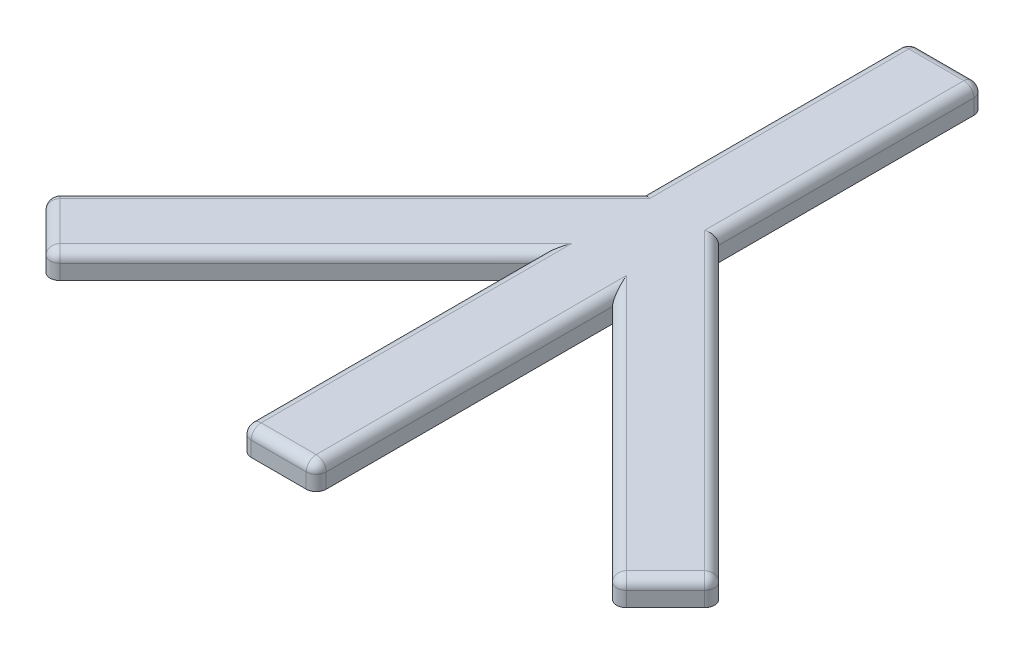
ISO-10303-21;
HEADER;
FILE_DESCRIPTION(('STEP AP214'),'2;1');
FILE_NAME('part.step','',(''),(''),'','','');
FILE_SCHEMA(('AUTOMOTIVE_DESIGN { 1 0 10303 214 1 1 1 1 }'));
ENDSEC;
DATA;
#1=APPLICATION_CONTEXT('core data for automotive mechanical design processes');
#2=APPLICATION_PROTOCOL_DEFINITION('international standard','automotive_design',2000,#1);
#3=PRODUCT_CONTEXT('',#1,'mechanical');
#4=PRODUCT('Part','Part','',(#3));
#5=PRODUCT_RELATED_PRODUCT_CATEGORY('part','',(#4));
#6=PRODUCT_DEFINITION_FORMATION('','',#4);
#7=PRODUCT_DEFINITION_CONTEXT('part definition',#1,'design');
#8=PRODUCT_DEFINITION('design','',#6,#7);
#9=PRODUCT_DEFINITION_SHAPE('','',#8);
#10=(LENGTH_UNIT() NAMED_UNIT(*) SI_UNIT(.MILLI.,.METRE.));
#11=(NAMED_UNIT(*) PLANE_ANGLE_UNIT() SI_UNIT($,.RADIAN.));
#12=(NAMED_UNIT(*) SI_UNIT($,.STERADIAN.) SOLID_ANGLE_UNIT());
#13=UNCERTAINTY_MEASURE_WITH_UNIT(LENGTH_MEASURE(1.E-05),#10,'distance_accuracy_value','');
#14=(GEOMETRIC_REPRESENTATION_CONTEXT(3) GLOBAL_UNCERTAINTY_ASSIGNED_CONTEXT((#13)) GLOBAL_UNIT_ASSIGNED_CONTEXT((#10,
#11,#12)) REPRESENTATION_CONTEXT('',''));
#15=CARTESIAN_POINT('',(0.,0.,0.));
#16=DIRECTION('',(0.,0.,1.));
#17=DIRECTION('',(1.,0.,0.));
#18=AXIS2_PLACEMENT_3D('',#15,#16,#17);
#19=CARTESIAN_POINT('',(56.5917249340142,5.,56.5917249340142));
#20=DIRECTION('',(-0.707106781186548,0.,-0.707106781186548));
#21=DIRECTION('',(-0.707106781186548,0.,0.707106781186548));
#22=AXIS2_PLACEMENT_3D('',#19,#20,#21);
#23=PLANE('',#22);
#24=DIRECTION('',(0.707106781186548,0.,-0.707106781186548));
#25=VECTOR('',#24,1.);
#26=CARTESIAN_POINT('',(56.5917249340142,0.,56.5917249340142));
#27=LINE('',#26,#25);
#28=CARTESIAN_POINT('',(58.0059384963873,0.,55.1775113716411));
#29=VERTEX_POINT('',#28);
#30=CARTESIAN_POINT('',(65.7841130894393,0.,47.3993367785891));
#31=VERTEX_POINT('',#30);
#32=EDGE_CURVE('E217',#29,#31,#27,.T.);
#33=ORIENTED_EDGE('',*,*,#32,.T.);
#34=DIRECTION('',(0.,-1.,0.));
#35=VECTOR('',#34,1.);
#36=CARTESIAN_POINT('',(65.7841130894393,5.,47.3993367785891));
#37=LINE('',#36,#35);
#38=CARTESIAN_POINT('',(65.7841130894393,3.,47.3993367785891));
#39=VERTEX_POINT('',#38);
#40=EDGE_CURVE('E391',#31,#39,#37,.F.);
#41=ORIENTED_EDGE('',*,*,#40,.T.);
#42=DIRECTION('',(0.707106781186548,0.,-0.707106781186548));
#43=VECTOR('',#42,1.);
#44=CARTESIAN_POINT('',(56.5917249340142,3.,56.5917249340142));
#45=LINE('',#44,#43);
#46=CARTESIAN_POINT('',(58.0059384963873,3.,55.1775113716411));
#47=VERTEX_POINT('',#46);
#48=EDGE_CURVE('E278',#39,#47,#45,.F.);
#49=ORIENTED_EDGE('',*,*,#48,.T.);
#50=DIRECTION('',(0.,-1.,0.));
#51=VECTOR('',#50,1.);
#52=CARTESIAN_POINT('',(58.0059384963873,0.,55.1775113716411));
#53=LINE('',#52,#51);
#54=EDGE_CURVE('E389',#47,#29,#53,.T.);
#55=ORIENTED_EDGE('',*,*,#54,.T.);
#56=EDGE_LOOP('',(#33,#41,#49,#55));
#57=FACE_BOUND('',#56,.T.);
#58=ADVANCED_FACE('F35',(#57),#23,.F.);
#59=CARTESIAN_POINT('',(10.6066017177982,5.,-10.6066017177982));
#60=DIRECTION('',(-0.707106781186547,0.,0.707106781186548));
#61=DIRECTION('',(0.707106781186548,0.,0.707106781186547));
#62=AXIS2_PLACEMENT_3D('',#59,#60,#61);
#63=PLANE('',#62);
#64=DIRECTION('',(-0.707106781186548,0.,-0.707106781186547));
#65=VECTOR('',#64,1.);
#66=CARTESIAN_POINT('',(67.1983266518124,3.,45.985123216216));
#67=LINE('',#66,#65);
#68=CARTESIAN_POINT('',(7.49999999999999,3.,-13.7132034355964));
#69=VERTEX_POINT('',#68);
#70=CARTESIAN_POINT('',(65.7841130894393,3.,44.5709096538429));
#71=VERTEX_POINT('',#70);
#72=EDGE_CURVE('E292',#69,#71,#67,.F.);
#73=ORIENTED_EDGE('',*,*,#72,.T.);
#74=DIRECTION('',(0.,-1.,0.));
#75=VECTOR('',#74,1.);
#76=CARTESIAN_POINT('',(65.7841130894393,5.,44.5709096538429));
#77=LINE('',#76,#75);
#78=CARTESIAN_POINT('',(65.7841130894393,0.,44.5709096538429));
#79=VERTEX_POINT('',#78);
#80=EDGE_CURVE('E52',#71,#79,#77,.T.);
#81=ORIENTED_EDGE('',*,*,#80,.T.);
#82=DIRECTION('',(-0.707106781186548,0.,-0.707106781186547));
#83=VECTOR('',#82,1.);
#84=CARTESIAN_POINT('',(10.6066017177982,0.,-10.6066017177982));
#85=LINE('',#84,#83);
#86=CARTESIAN_POINT('',(7.49999999999999,0.,-13.7132034355964));
#87=VERTEX_POINT('',#86);
#88=EDGE_CURVE('E210',#79,#87,#85,.T.);
#89=ORIENTED_EDGE('',*,*,#88,.T.);
#90=DIRECTION('',(0.,-1.,0.));
#91=VECTOR('',#90,1.);
#92=CARTESIAN_POINT('',(7.49999999999999,5.,-13.7132034355964));
#93=LINE('',#92,#91);
#94=EDGE_CURVE('E213',#69,#87,#93,.T.);
#95=ORIENTED_EDGE('',*,*,#94,.F.);
#96=EDGE_LOOP('',(#73,#81,#89,#95));
#97=FACE_BOUND('',#96,.T.);
#98=ADVANCED_FACE('F212',(#97),#63,.F.);
#99=CARTESIAN_POINT('',(0.,5.,0.));
#100=DIRECTION('',(-0.707106781186548,0.,0.707106781186548));
#101=DIRECTION('',(0.707106781186548,0.,0.707106781186548));
#102=AXIS2_PLACEMENT_3D('',#99,#100,#101);
#103=PLANE('',#102);
#104=DIRECTION('',(-0.707106781186548,0.,-0.707106781186548));
#105=VECTOR('',#104,1.);
#106=CARTESIAN_POINT('',(0.,0.,0.));
#107=LINE('',#106,#105);
#108=CARTESIAN_POINT('',(55.1775113716411,0.,55.1775113716411));
#109=VERTEX_POINT('',#108);
#110=CARTESIAN_POINT('',(7.49999999999999,0.,7.49999999999999));
#111=VERTEX_POINT('',#110);
#112=EDGE_CURVE('E216',#109,#111,#107,.T.);
#113=ORIENTED_EDGE('',*,*,#112,.F.);
#114=DIRECTION('',(0.,-1.,0.));
#115=VECTOR('',#114,1.);
#116=CARTESIAN_POINT('',(55.1775113716411,3.,55.1775113716411));
#117=LINE('',#116,#115);
#118=CARTESIAN_POINT('',(55.1775113716411,3.,55.1775113716411));
#119=VERTEX_POINT('',#118);
#120=EDGE_CURVE('E393',#109,#119,#117,.F.);
#121=ORIENTED_EDGE('',*,*,#120,.T.);
#122=DIRECTION('',(-0.707106781186548,0.,-0.707106781186548));
#123=VECTOR('',#122,1.);
#124=CARTESIAN_POINT('',(0.,3.,0.));
#125=LINE('',#124,#123);
#126=CARTESIAN_POINT('',(7.49999999999999,3.,7.49999999999999));
#127=VERTEX_POINT('',#126);
#128=EDGE_CURVE('E298',#119,#127,#125,.T.);
#129=ORIENTED_EDGE('',*,*,#128,.T.);
#130=DIRECTION('',(0.,-1.,0.));
#131=VECTOR('',#130,1.);
#132=CARTESIAN_POINT('',(7.49999999999999,5.,7.49999999999999));
#133=LINE('',#132,#131);
#134=EDGE_CURVE('E226',#127,#111,#133,.T.);
#135=ORIENTED_EDGE('',*,*,#134,.T.);
#136=EDGE_LOOP('',(#113,#121,#129,#135));
#137=FACE_BOUND('',#136,.T.);
#138=ADVANCED_FACE('F597',(#137),#103,.T.);
#139=CARTESIAN_POINT('',(0.,5.,0.));
#140=DIRECTION('',(0.,1.,0.));
#141=DIRECTION('',(0.,0.,1.));
#142=AXIS2_PLACEMENT_3D('',#139,#140,#141);
#143=PLANE('',#142);
#144=DIRECTION('',(0.707106781186548,0.,-0.707106781186548));
#145=VECTOR('',#144,1.);
#146=CARTESIAN_POINT('',(65.7841130894393,5.,44.5709096538429));
#147=LINE('',#146,#145);
#148=CARTESIAN_POINT('',(56.5917249340142,5.,53.763297809268));
#149=VERTEX_POINT('',#148);
#150=CARTESIAN_POINT('',(64.3698995270663,5.,45.985123216216));
#151=VERTEX_POINT('',#150);
#152=EDGE_CURVE('E267',#149,#151,#147,.T.);
#153=ORIENTED_EDGE('',*,*,#152,.T.);
#154=DIRECTION('',(-0.707106781186548,0.,-0.707106781186547));
#155=VECTOR('',#154,1.);
#156=CARTESIAN_POINT('',(6.08578643762689,5.,-12.2989898732233));
#157=LINE('',#156,#155);
#158=CARTESIAN_POINT('',(5.49999999999999,5.,-12.8847763108502));
#159=VERTEX_POINT('',#158);
#160=EDGE_CURVE('E276',#151,#159,#157,.T.);
#161=ORIENTED_EDGE('',*,*,#160,.T.);
#162=DIRECTION('',(0.,0.,-1.));
#163=VECTOR('',#162,1.);
#164=CARTESIAN_POINT('',(5.49999999999999,5.,-66.6939874331421));
#165=LINE('',#164,#163);
#166=CARTESIAN_POINT('',(5.49999999999999,5.,-64.6939874331421));
#167=VERTEX_POINT('',#166);
#168=EDGE_CURVE('E273',#159,#167,#165,.T.);
#169=ORIENTED_EDGE('',*,*,#168,.T.);
#170=DIRECTION('',(1.,0.,0.));
#171=VECTOR('',#170,1.);
#172=CARTESIAN_POINT('',(0.,5.,-64.6939874331421));
#173=LINE('',#172,#171);
#174=CARTESIAN_POINT('',(-5.50000000000001,5.,-64.6939874331421));
#175=VERTEX_POINT('',#174);
#176=EDGE_CURVE('E270',#167,#175,#173,.F.);
#177=ORIENTED_EDGE('',*,*,#176,.T.);
#178=DIRECTION('',(0.,0.,-1.));
#179=VECTOR('',#178,1.);
#180=CARTESIAN_POINT('',(-5.50000000000001,5.,0.));
#181=LINE('',#180,#179);
#182=CARTESIAN_POINT('',(-5.50000000000001,5.,-12.8847763108502));
#183=VERTEX_POINT('',#182);
#184=EDGE_CURVE('E265',#175,#183,#181,.F.);
#185=ORIENTED_EDGE('',*,*,#184,.T.);
#186=DIRECTION('',(0.707106781186548,0.,-0.707106781186548));
#187=VECTOR('',#186,1.);
#188=CARTESIAN_POINT('',(-9.19238815542509,5.,-9.19238815542509));
#189=LINE('',#188,#187);
#190=CARTESIAN_POINT('',(-64.3698995270662,5.,45.985123216216));
#191=VERTEX_POINT('',#190);
#192=EDGE_CURVE('E259',#183,#191,#189,.F.);
#193=ORIENTED_EDGE('',*,*,#192,.T.);
#194=DIRECTION('',(-0.707106781186548,0.,-0.707106781186547));
#195=VECTOR('',#194,1.);
#196=CARTESIAN_POINT('',(-55.1775113716411,5.,55.1775113716411));
#197=LINE('',#196,#195);
#198=CARTESIAN_POINT('',(-56.5917249340145,5.,53.7632978092677));
#199=VERTEX_POINT('',#198);
#200=EDGE_CURVE('E251',#191,#199,#197,.F.);
#201=ORIENTED_EDGE('',*,*,#200,.T.);
#202=DIRECTION('',(0.707106781186551,0.,-0.707106781186544));
#203=VECTOR('',#202,1.);
#204=CARTESIAN_POINT('',(-8.9142135623731,5.,6.08578643762685));
#205=LINE('',#204,#203);
#206=CARTESIAN_POINT('',(-5.50000000000001,5.,2.6715728752538));
#207=VERTEX_POINT('',#206);
#208=EDGE_CURVE('E246',#199,#207,#205,.T.);
#209=ORIENTED_EDGE('',*,*,#208,.T.);
#210=DIRECTION('',(0.,0.,-1.));
#211=VECTOR('',#210,1.);
#212=CARTESIAN_POINT('',(-5.50000000000001,5.,0.));
#213=LINE('',#212,#211);
#214=CARTESIAN_POINT('',(-5.50000000000001,5.,64.6939874331421));
#215=VERTEX_POINT('',#214);
#216=EDGE_CURVE('E248',#207,#215,#213,.F.);
#217=ORIENTED_EDGE('',*,*,#216,.T.);
#218=DIRECTION('',(1.,0.,0.));
#219=VECTOR('',#218,1.);
#220=CARTESIAN_POINT('',(7.49999999999999,5.,64.6939874331421));
#221=LINE('',#220,#219);
#222=CARTESIAN_POINT('',(5.49999999999999,5.,64.6939874331421));
#223=VERTEX_POINT('',#222);
#224=EDGE_CURVE('E254',#215,#223,#221,.T.);
#225=ORIENTED_EDGE('',*,*,#224,.T.);
#226=DIRECTION('',(0.,0.,-1.));
#227=VECTOR('',#226,1.);
#228=CARTESIAN_POINT('',(5.49999999999999,5.,7.49999999999999));
#229=LINE('',#228,#227);
#230=CARTESIAN_POINT('',(5.49999999999999,5.,2.6715728752538));
#231=VERTEX_POINT('',#230);
#232=EDGE_CURVE('E257',#223,#231,#229,.T.);
#233=ORIENTED_EDGE('',*,*,#232,.T.);
#234=DIRECTION('',(-0.707106781186548,0.,-0.707106781186548));
#235=VECTOR('',#234,1.);
#236=CARTESIAN_POINT('',(1.4142135623731,5.,-1.4142135623731));
#237=LINE('',#236,#235);
#238=EDGE_CURVE('E262',#231,#149,#237,.F.);
#239=ORIENTED_EDGE('',*,*,#238,.T.);
#240=EDGE_LOOP('',(#153,#161,#169,#177,#185,#193,#201,#209,#217,#225,#233,#239));
#241=FACE_BOUND('',#240,.T.);
#242=ADVANCED_FACE('F477',(#241),#143,.T.);
#243=CARTESIAN_POINT('',(0.,0.,0.));
#244=DIRECTION('',(0.,1.,0.));
#245=DIRECTION('',(0.,0.,1.));
#246=AXIS2_PLACEMENT_3D('',#243,#244,#245);
#247=PLANE('',#246);
#248=DIRECTION('',(1.,0.,0.));
#249=VECTOR('',#248,1.);
#250=CARTESIAN_POINT('',(-7.50000000000001,0.,-66.6939874331421));
#251=LINE('',#250,#249);
#252=CARTESIAN_POINT('',(-5.50000000000001,0.,-66.6939874331421));
#253=VERTEX_POINT('',#252);
#254=CARTESIAN_POINT('',(5.49999999999999,0.,-66.6939874331421));
#255=VERTEX_POINT('',#254);
#256=EDGE_CURVE('E230',#253,#255,#251,.T.);
#257=ORIENTED_EDGE('',*,*,#256,.T.);
#258=CARTESIAN_POINT('',(5.49999999999999,0.,-64.6939874331421));
#259=DIRECTION('',(0.,1.,0.));
#260=DIRECTION('',(0.,0.,1.));
#261=AXIS2_PLACEMENT_3D('',#258,#259,#260);
#262=CIRCLE('',#261,2.);
#263=CARTESIAN_POINT('',(7.49999999999999,0.,-64.6939874331421));
#264=VERTEX_POINT('',#263);
#265=EDGE_CURVE('E60',#255,#264,#262,.F.);
#266=ORIENTED_EDGE('',*,*,#265,.T.);
#267=DIRECTION('',(0.,0.,-1.));
#268=VECTOR('',#267,1.);
#269=CARTESIAN_POINT('',(7.49999999999999,0.,66.6939874331421));
#270=LINE('',#269,#268);
#271=EDGE_CURVE('E221',#87,#264,#270,.T.);
#272=ORIENTED_EDGE('',*,*,#271,.F.);
#273=ORIENTED_EDGE('',*,*,#88,.F.);
#274=CARTESIAN_POINT('',(64.3698995270663,0.,45.985123216216));
#275=DIRECTION('',(0.,1.,0.));
#276=DIRECTION('',(0.,0.,1.));
#277=AXIS2_PLACEMENT_3D('',#274,#275,#276);
#278=CIRCLE('',#277,2.);
#279=EDGE_CURVE('E367',#79,#31,#278,.F.);
#280=ORIENTED_EDGE('',*,*,#279,.T.);
#281=ORIENTED_EDGE('',*,*,#32,.F.);
#282=CARTESIAN_POINT('',(56.5917249340142,0.,53.763297809268));
#283=DIRECTION('',(0.,1.,0.));
#284=DIRECTION('',(0.,0.,1.));
#285=AXIS2_PLACEMENT_3D('',#282,#283,#284);
#286=CIRCLE('',#285,2.);
#287=EDGE_CURVE('E365',#29,#109,#286,.F.);
#288=ORIENTED_EDGE('',*,*,#287,.T.);
#289=ORIENTED_EDGE('',*,*,#112,.T.);
#290=CARTESIAN_POINT('',(7.49999999999999,0.,64.6939874331421));
#291=VERTEX_POINT('',#290);
#292=EDGE_CURVE('E229',#291,#111,#270,.T.);
#293=ORIENTED_EDGE('',*,*,#292,.F.);
#294=CARTESIAN_POINT('',(5.49999999999999,0.,64.6939874331421));
#295=DIRECTION('',(0.,1.,0.));
#296=DIRECTION('',(0.,0.,1.));
#297=AXIS2_PLACEMENT_3D('',#294,#295,#296);
#298=CIRCLE('',#297,2.);
#299=CARTESIAN_POINT('',(5.49999999999999,0.,66.6939874331421));
#300=VERTEX_POINT('',#299);
#301=EDGE_CURVE('E361',#291,#300,#298,.F.);
#302=ORIENTED_EDGE('',*,*,#301,.T.);
#303=DIRECTION('',(1.,0.,0.));
#304=VECTOR('',#303,1.);
#305=CARTESIAN_POINT('',(-7.50000000000001,0.,66.6939874331421));
#306=LINE('',#305,#304);
#307=CARTESIAN_POINT('',(-5.50000000000001,0.,66.6939874331421));
#308=VERTEX_POINT('',#307);
#309=EDGE_CURVE('E232',#308,#300,#306,.T.);
#310=ORIENTED_EDGE('',*,*,#309,.F.);
#311=CARTESIAN_POINT('',(-5.50000000000001,0.,64.6939874331421));
#312=DIRECTION('',(0.,1.,0.));
#313=DIRECTION('',(0.,0.,1.));
#314=AXIS2_PLACEMENT_3D('',#311,#312,#313);
#315=CIRCLE('',#314,2.);
#316=CARTESIAN_POINT('',(-7.50000000000001,0.,64.6939874331421));
#317=VERTEX_POINT('',#316);
#318=EDGE_CURVE('E363',#308,#317,#315,.F.);
#319=ORIENTED_EDGE('',*,*,#318,.T.);
#320=DIRECTION('',(0.,0.,-1.));
#321=VECTOR('',#320,1.);
#322=CARTESIAN_POINT('',(-7.50000000000001,0.,66.6939874331421));
#323=LINE('',#322,#321);
#324=CARTESIAN_POINT('',(-7.50000000000001,0.,7.49999999999995));
#325=VERTEX_POINT('',#324);
#326=EDGE_CURVE('E240',#317,#325,#323,.T.);
#327=ORIENTED_EDGE('',*,*,#326,.T.);
#328=DIRECTION('',(0.707106781186551,0.,-0.707106781186544));
#329=VECTOR('',#328,1.);
#330=CARTESIAN_POINT('',(0.,0.,0.));
#331=LINE('',#330,#329);
#332=CARTESIAN_POINT('',(-55.1775113716414,0.,55.1775113716409));
#333=VERTEX_POINT('',#332);
#334=EDGE_CURVE('E447',#333,#325,#331,.T.);
#335=ORIENTED_EDGE('',*,*,#334,.F.);
#336=CARTESIAN_POINT('',(-56.5917249340145,0.,53.7632978092678));
#337=DIRECTION('',(0.,1.,0.));
#338=DIRECTION('',(0.,0.,1.));
#339=AXIS2_PLACEMENT_3D('',#336,#337,#338);
#340=CIRCLE('',#339,2.);
#341=CARTESIAN_POINT('',(-58.0059384963876,0.,55.1775113716408));
#342=VERTEX_POINT('',#341);
#343=EDGE_CURVE('E369',#333,#342,#340,.F.);
#344=ORIENTED_EDGE('',*,*,#343,.T.);
#345=DIRECTION('',(-0.707106781186548,0.,-0.707106781186547));
#346=VECTOR('',#345,1.);
#347=CARTESIAN_POINT('',(-56.5917249340142,0.,56.5917249340142));
#348=LINE('',#347,#346);
#349=CARTESIAN_POINT('',(-65.7841130894393,0.,47.3993367785891));
#350=VERTEX_POINT('',#349);
#351=EDGE_CURVE('E444',#342,#350,#348,.T.);
#352=ORIENTED_EDGE('',*,*,#351,.T.);
#353=CARTESIAN_POINT('',(-64.3698995270662,0.,45.985123216216));
#354=DIRECTION('',(0.,1.,0.));
#355=DIRECTION('',(0.,0.,1.));
#356=AXIS2_PLACEMENT_3D('',#353,#354,#355);
#357=CIRCLE('',#356,2.);
#358=CARTESIAN_POINT('',(-65.7841130894393,0.,44.5709096538429));
#359=VERTEX_POINT('',#358);
#360=EDGE_CURVE('E371',#350,#359,#357,.F.);
#361=ORIENTED_EDGE('',*,*,#360,.T.);
#362=DIRECTION('',(0.707106781186548,0.,-0.707106781186548));
#363=VECTOR('',#362,1.);
#364=CARTESIAN_POINT('',(-10.6066017177982,0.,-10.6066017177982));
#365=LINE('',#364,#363);
#366=CARTESIAN_POINT('',(-7.50000000000001,0.,-13.7132034355964));
#367=VERTEX_POINT('',#366);
#368=EDGE_CURVE('E243',#359,#367,#365,.T.);
#369=ORIENTED_EDGE('',*,*,#368,.T.);
#370=CARTESIAN_POINT('',(-7.50000000000001,0.,-64.6939874331421));
#371=VERTEX_POINT('',#370);
#372=EDGE_CURVE('E239',#367,#371,#323,.T.);
#373=ORIENTED_EDGE('',*,*,#372,.T.);
#374=CARTESIAN_POINT('',(-5.50000000000001,0.,-64.6939874331421));
#375=DIRECTION('',(0.,1.,0.));
#376=DIRECTION('',(0.,0.,1.));
#377=AXIS2_PLACEMENT_3D('',#374,#375,#376);
#378=CIRCLE('',#377,2.);
#379=EDGE_CURVE('E373',#371,#253,#378,.F.);
#380=ORIENTED_EDGE('',*,*,#379,.T.);
#381=EDGE_LOOP('',(#257,#266,#272,#273,#280,#281,#288,#289,#293,#302,#310,#319,#327,#335,#344,
#352,#361,#369,#373,#380));
#382=FACE_BOUND('',#381,.T.);
#383=ADVANCED_FACE('F228',(#382),#247,.F.);
#384=CARTESIAN_POINT('',(0.,5.,0.));
#385=DIRECTION('',(-0.707106781186544,0.,-0.707106781186551));
#386=DIRECTION('',(-0.707106781186551,0.,0.707106781186544));
#387=AXIS2_PLACEMENT_3D('',#384,#385,#386);
#388=PLANE('',#387);
#389=DIRECTION('',(0.707106781186551,0.,-0.707106781186544));
#390=VECTOR('',#389,1.);
#391=CARTESIAN_POINT('',(-56.5917249340145,3.,56.5917249340139));
#392=LINE('',#391,#390);
#393=CARTESIAN_POINT('',(-7.50000000000001,3.,7.49999999999995));
#394=VERTEX_POINT('',#393);
#395=CARTESIAN_POINT('',(-55.1775113716414,3.,55.1775113716409));
#396=VERTEX_POINT('',#395);
#397=EDGE_CURVE('E302',#394,#396,#392,.F.);
#398=ORIENTED_EDGE('',*,*,#397,.T.);
#399=DIRECTION('',(0.,-1.,0.));
#400=VECTOR('',#399,1.);
#401=CARTESIAN_POINT('',(-55.1775113716414,0.,55.1775113716409));
#402=LINE('',#401,#400);
#403=EDGE_CURVE('E386',#396,#333,#402,.T.);
#404=ORIENTED_EDGE('',*,*,#403,.T.);
#405=ORIENTED_EDGE('',*,*,#334,.T.);
#406=DIRECTION('',(0.,-1.,0.));
#407=VECTOR('',#406,1.);
#408=CARTESIAN_POINT('',(-7.50000000000001,5.,7.49999999999995));
#409=LINE('',#408,#407);
#410=EDGE_CURVE('E451',#394,#325,#409,.T.);
#411=ORIENTED_EDGE('',*,*,#410,.F.);
#412=EDGE_LOOP('',(#398,#404,#405,#411));
#413=FACE_BOUND('',#412,.T.);
#414=ADVANCED_FACE('F541',(#413),#388,.F.);
#415=CARTESIAN_POINT('',(-56.5917249340142,5.,56.5917249340142));
#416=DIRECTION('',(-0.707106781186547,0.,0.707106781186548));
#417=DIRECTION('',(0.707106781186548,0.,0.707106781186547));
#418=AXIS2_PLACEMENT_3D('',#415,#416,#417);
#419=PLANE('',#418);
#420=DIRECTION('',(-0.707106781186548,0.,-0.707106781186547));
#421=VECTOR('',#420,1.);
#422=CARTESIAN_POINT('',(-56.5917249340142,3.,56.5917249340142));
#423=LINE('',#422,#421);
#424=CARTESIAN_POINT('',(-58.0059384963876,3.,55.1775113716408));
#425=VERTEX_POINT('',#424);
#426=CARTESIAN_POINT('',(-65.7841130894393,3.,47.3993367785891));
#427=VERTEX_POINT('',#426);
#428=EDGE_CURVE('E284',#425,#427,#423,.T.);
#429=ORIENTED_EDGE('',*,*,#428,.T.);
#430=DIRECTION('',(0.,-1.,0.));
#431=VECTOR('',#430,1.);
#432=CARTESIAN_POINT('',(-65.7841130894393,5.,47.3993367785891));
#433=LINE('',#432,#431);
#434=EDGE_CURVE('E382',#427,#350,#433,.T.);
#435=ORIENTED_EDGE('',*,*,#434,.T.);
#436=ORIENTED_EDGE('',*,*,#351,.F.);
#437=DIRECTION('',(0.,-1.,0.));
#438=VECTOR('',#437,1.);
#439=CARTESIAN_POINT('',(-58.0059384963876,3.,55.1775113716408));
#440=LINE('',#439,#438);
#441=EDGE_CURVE('E380',#342,#425,#440,.F.);
#442=ORIENTED_EDGE('',*,*,#441,.T.);
#443=EDGE_LOOP('',(#429,#435,#436,#442));
#444=FACE_BOUND('',#443,.T.);
#445=ADVANCED_FACE('F551',(#444),#419,.T.);
#446=CARTESIAN_POINT('',(-10.6066017177982,5.,-10.6066017177982));
#447=DIRECTION('',(-0.707106781186548,0.,-0.707106781186548));
#448=DIRECTION('',(-0.707106781186548,0.,0.707106781186548));
#449=AXIS2_PLACEMENT_3D('',#446,#447,#448);
#450=PLANE('',#449);
#451=ORIENTED_EDGE('',*,*,#368,.F.);
#452=DIRECTION('',(0.,-1.,0.));
#453=VECTOR('',#452,1.);
#454=CARTESIAN_POINT('',(-65.7841130894393,5.,44.5709096538429));
#455=LINE('',#454,#453);
#456=CARTESIAN_POINT('',(-65.7841130894393,3.,44.5709096538429));
#457=VERTEX_POINT('',#456);
#458=EDGE_CURVE('E384',#359,#457,#455,.F.);
#459=ORIENTED_EDGE('',*,*,#458,.T.);
#460=DIRECTION('',(0.707106781186548,0.,-0.707106781186548));
#461=VECTOR('',#460,1.);
#462=CARTESIAN_POINT('',(-10.6066017177982,3.,-10.6066017177982));
#463=LINE('',#462,#461);
#464=CARTESIAN_POINT('',(-7.50000000000001,3.,-13.7132034355964));
#465=VERTEX_POINT('',#464);
#466=EDGE_CURVE('E287',#457,#465,#463,.T.);
#467=ORIENTED_EDGE('',*,*,#466,.T.);
#468=DIRECTION('',(0.,-1.,0.));
#469=VECTOR('',#468,1.);
#470=CARTESIAN_POINT('',(-7.50000000000001,5.,-13.7132034355964));
#471=LINE('',#470,#469);
#472=EDGE_CURVE('E449',#465,#367,#471,.T.);
#473=ORIENTED_EDGE('',*,*,#472,.T.);
#474=EDGE_LOOP('',(#451,#459,#467,#473));
#475=FACE_BOUND('',#474,.T.);
#476=ADVANCED_FACE('F574',(#475),#450,.T.);
#477=CARTESIAN_POINT('',(-7.50000000000001,5.,66.6939874331421));
#478=DIRECTION('',(-1.,0.,0.));
#479=DIRECTION('',(0.,0.,1.));
#480=AXIS2_PLACEMENT_3D('',#477,#478,#479);
#481=PLANE('',#480);
#482=ORIENTED_EDGE('',*,*,#326,.F.);
#483=DIRECTION('',(0.,-1.,0.));
#484=VECTOR('',#483,1.);
#485=CARTESIAN_POINT('',(-7.50000000000001,3.,64.6939874331421));
#486=LINE('',#485,#484);
#487=CARTESIAN_POINT('',(-7.50000000000001,3.,64.6939874331421));
#488=VERTEX_POINT('',#487);
#489=EDGE_CURVE('E44',#317,#488,#486,.F.);
#490=ORIENTED_EDGE('',*,*,#489,.T.);
#491=DIRECTION('',(0.,0.,-1.));
#492=VECTOR('',#491,1.);
#493=CARTESIAN_POINT('',(-7.50000000000001,3.,66.6939874331421));
#494=LINE('',#493,#492);
#495=EDGE_CURVE('E300',#488,#394,#494,.T.);
#496=ORIENTED_EDGE('',*,*,#495,.T.);
#497=ORIENTED_EDGE('',*,*,#410,.T.);
#498=EDGE_LOOP('',(#482,#490,#496,#497));
#499=FACE_BOUND('',#498,.T.);
#500=ADVANCED_FACE('F577',(#499),#481,.T.);
#501=DIRECTION('',(0.,0.,-1.));
#502=VECTOR('',#501,1.);
#503=CARTESIAN_POINT('',(-7.50000000000001,3.,66.6939874331421));
#504=LINE('',#503,#502);
#505=CARTESIAN_POINT('',(-7.50000000000001,3.,-64.6939874331421));
#506=VERTEX_POINT('',#505);
#507=EDGE_CURVE('E289',#465,#506,#504,.T.);
#508=ORIENTED_EDGE('',*,*,#507,.T.);
#509=DIRECTION('',(0.,-1.,0.));
#510=VECTOR('',#509,1.);
#511=CARTESIAN_POINT('',(-7.50000000000001,5.,-64.6939874331421));
#512=LINE('',#511,#510);
#513=EDGE_CURVE('E378',#506,#371,#512,.T.);
#514=ORIENTED_EDGE('',*,*,#513,.T.);
#515=ORIENTED_EDGE('',*,*,#372,.F.);
#516=ORIENTED_EDGE('',*,*,#472,.F.);
#517=EDGE_LOOP('',(#508,#514,#515,#516));
#518=FACE_BOUND('',#517,.T.);
#519=ADVANCED_FACE('F517',(#518),#481,.T.);
#520=CARTESIAN_POINT('',(-7.50000000000001,5.,66.6939874331421));
#521=DIRECTION('',(0.,0.,-1.));
#522=DIRECTION('',(-1.,0.,0.));
#523=AXIS2_PLACEMENT_3D('',#520,#521,#522);
#524=PLANE('',#523);
#525=DIRECTION('',(1.,0.,0.));
#526=VECTOR('',#525,1.);
#527=CARTESIAN_POINT('',(-7.50000000000001,3.,66.6939874331421));
#528=LINE('',#527,#526);
#529=CARTESIAN_POINT('',(5.49999999999999,3.,66.6939874331421));
#530=VERTEX_POINT('',#529);
#531=CARTESIAN_POINT('',(-5.50000000000001,3.,66.6939874331421));
#532=VERTEX_POINT('',#531);
#533=EDGE_CURVE('E281',#530,#532,#528,.F.);
#534=ORIENTED_EDGE('',*,*,#533,.T.);
#535=DIRECTION('',(0.,-1.,0.));
#536=VECTOR('',#535,1.);
#537=CARTESIAN_POINT('',(-5.50000000000001,0.,66.6939874331421));
#538=LINE('',#537,#536);
#539=EDGE_CURVE('E397',#532,#308,#538,.T.);
#540=ORIENTED_EDGE('',*,*,#539,.T.);
#541=ORIENTED_EDGE('',*,*,#309,.T.);
#542=DIRECTION('',(0.,-1.,0.));
#543=VECTOR('',#542,1.);
#544=CARTESIAN_POINT('',(5.49999999999999,5.,66.6939874331421));
#545=LINE('',#544,#543);
#546=EDGE_CURVE('E395',#300,#530,#545,.F.);
#547=ORIENTED_EDGE('',*,*,#546,.T.);
#548=EDGE_LOOP('',(#534,#540,#541,#547));
#549=FACE_BOUND('',#548,.T.);
#550=ADVANCED_FACE('F575',(#549),#524,.F.);
#551=CARTESIAN_POINT('',(-7.50000000000001,5.,-66.6939874331421));
#552=DIRECTION('',(0.,0.,-1.));
#553=DIRECTION('',(-1.,0.,0.));
#554=AXIS2_PLACEMENT_3D('',#551,#552,#553);
#555=PLANE('',#554);
#556=DIRECTION('',(1.,0.,0.));
#557=VECTOR('',#556,1.);
#558=CARTESIAN_POINT('',(-7.50000000000001,3.,-66.6939874331421));
#559=LINE('',#558,#557);
#560=CARTESIAN_POINT('',(-5.50000000000001,3.,-66.6939874331421));
#561=VERTEX_POINT('',#560);
#562=CARTESIAN_POINT('',(5.49999999999999,3.,-66.6939874331421));
#563=VERTEX_POINT('',#562);
#564=EDGE_CURVE('E225',#561,#563,#559,.T.);
#565=ORIENTED_EDGE('',*,*,#564,.T.);
#566=DIRECTION('',(0.,-1.,0.));
#567=VECTOR('',#566,1.);
#568=CARTESIAN_POINT('',(5.49999999999999,0.,-66.6939874331421));
#569=LINE('',#568,#567);
#570=EDGE_CURVE('E359',#563,#255,#569,.T.);
#571=ORIENTED_EDGE('',*,*,#570,.T.);
#572=ORIENTED_EDGE('',*,*,#256,.F.);
#573=DIRECTION('',(0.,-1.,0.));
#574=VECTOR('',#573,1.);
#575=CARTESIAN_POINT('',(-5.50000000000001,5.,-66.6939874331421));
#576=LINE('',#575,#574);
#577=EDGE_CURVE('E357',#253,#561,#576,.F.);
#578=ORIENTED_EDGE('',*,*,#577,.T.);
#579=EDGE_LOOP('',(#565,#571,#572,#578));
#580=FACE_BOUND('',#579,.T.);
#581=ADVANCED_FACE('F501',(#580),#555,.T.);
#582=CARTESIAN_POINT('',(7.49999999999999,5.,66.6939874331421));
#583=DIRECTION('',(-1.,0.,0.));
#584=DIRECTION('',(0.,0.,1.));
#585=AXIS2_PLACEMENT_3D('',#582,#583,#584);
#586=PLANE('',#585);
#587=ORIENTED_EDGE('',*,*,#271,.T.);
#588=DIRECTION('',(0.,-1.,0.));
#589=VECTOR('',#588,1.);
#590=CARTESIAN_POINT('',(7.49999999999999,3.,-64.6939874331421));
#591=LINE('',#590,#589);
#592=CARTESIAN_POINT('',(7.49999999999999,3.,-64.6939874331421));
#593=VERTEX_POINT('',#592);
#594=EDGE_CURVE('E376',#264,#593,#591,.F.);
#595=ORIENTED_EDGE('',*,*,#594,.T.);
#596=DIRECTION('',(0.,0.,-1.));
#597=VECTOR('',#596,1.);
#598=CARTESIAN_POINT('',(7.49999999999999,3.,-13.7132034355964));
#599=LINE('',#598,#597);
#600=EDGE_CURVE('E224',#593,#69,#599,.F.);
#601=ORIENTED_EDGE('',*,*,#600,.T.);
#602=ORIENTED_EDGE('',*,*,#94,.T.);
#603=EDGE_LOOP('',(#587,#595,#601,#602));
#604=FACE_BOUND('',#603,.T.);
#605=ADVANCED_FACE('F220',(#604),#586,.F.);
#606=DIRECTION('',(0.,0.,-1.));
#607=VECTOR('',#606,1.);
#608=CARTESIAN_POINT('',(7.49999999999999,3.,66.6939874331421));
#609=LINE('',#608,#607);
#610=CARTESIAN_POINT('',(7.49999999999999,3.,64.6939874331421));
#611=VERTEX_POINT('',#610);
#612=EDGE_CURVE('E295',#127,#611,#609,.F.);
#613=ORIENTED_EDGE('',*,*,#612,.T.);
#614=DIRECTION('',(0.,-1.,0.));
#615=VECTOR('',#614,1.);
#616=CARTESIAN_POINT('',(7.49999999999999,5.,64.6939874331421));
#617=LINE('',#616,#615);
#618=EDGE_CURVE('E11',#611,#291,#617,.T.);
#619=ORIENTED_EDGE('',*,*,#618,.T.);
#620=ORIENTED_EDGE('',*,*,#292,.T.);
#621=ORIENTED_EDGE('',*,*,#134,.F.);
#622=EDGE_LOOP('',(#613,#619,#620,#621));
#623=FACE_BOUND('',#622,.T.);
#624=ADVANCED_FACE('F435',(#623),#586,.F.);
#625=CARTESIAN_POINT('',(0.,3.,64.6939874331421));
#626=DIRECTION('',(-1.,0.,0.));
#627=DIRECTION('',(0.,0.,1.));
#628=AXIS2_PLACEMENT_3D('',#625,#626,#627);
#629=CYLINDRICAL_SURFACE('',#628,2.);
#630=ORIENTED_EDGE('',*,*,#224,.F.);
#631=CARTESIAN_POINT('',(-5.50000000000001,3.,64.6939874331421));
#632=DIRECTION('',(-1.,0.,0.));
#633=DIRECTION('',(0.,0.,1.));
#634=AXIS2_PLACEMENT_3D('',#631,#632,#633);
#635=CIRCLE('',#634,2.);
#636=EDGE_CURVE('E352',#215,#532,#635,.F.);
#637=ORIENTED_EDGE('',*,*,#636,.T.);
#638=ORIENTED_EDGE('',*,*,#533,.F.);
#639=CARTESIAN_POINT('',(5.49999999999999,3.,64.6939874331421));
#640=DIRECTION('',(-1.,0.,0.));
#641=DIRECTION('',(0.,0.,1.));
#642=AXIS2_PLACEMENT_3D('',#639,#640,#641);
#643=CIRCLE('',#642,2.);
#644=EDGE_CURVE('E350',#530,#223,#643,.T.);
#645=ORIENTED_EDGE('',*,*,#644,.T.);
#646=EDGE_LOOP('',(#630,#637,#638,#645));
#647=FACE_BOUND('',#646,.T.);
#648=ADVANCED_FACE('F573',(#647),#629,.T.);
#649=CARTESIAN_POINT('',(-5.50000000000001,3.,66.6939874331421));
#650=DIRECTION('',(0.,0.,-1.));
#651=DIRECTION('',(-1.,0.,0.));
#652=AXIS2_PLACEMENT_3D('',#649,#650,#651);
#653=CYLINDRICAL_SURFACE('',#652,2.);
#654=ORIENTED_EDGE('',*,*,#495,.F.);
#655=CARTESIAN_POINT('',(-5.50000000000001,3.,64.6939874331421));
#656=DIRECTION('',(0.,0.,-1.));
#657=DIRECTION('',(-1.,0.,0.));
#658=AXIS2_PLACEMENT_3D('',#655,#656,#657);
#659=CIRCLE('',#658,2.);
#660=EDGE_CURVE('E347',#488,#215,#659,.T.);
#661=ORIENTED_EDGE('',*,*,#660,.T.);
#662=ORIENTED_EDGE('',*,*,#216,.F.);
#663=CARTESIAN_POINT('',(-5.50000000000001,3.,2.6715728752538));
#664=DIRECTION('',(-0.923879532511286,0.,-0.382683432365092));
#665=DIRECTION('',(0.382683432365092,0.,-0.923879532511286));
#666=AXIS2_PLACEMENT_3D('',#663,#664,#665);
#667=ELLIPSE('',#666,5.22625185950547,2.);
#668=EDGE_CURVE('E233',#394,#207,#667,.T.);
#669=ORIENTED_EDGE('',*,*,#668,.F.);
#670=EDGE_LOOP('',(#654,#661,#662,#669));
#671=FACE_BOUND('',#670,.T.);
#672=ADVANCED_FACE('F662',(#671),#653,.T.);
#673=CARTESIAN_POINT('',(5.49999999999999,3.,0.));
#674=DIRECTION('',(0.,0.,1.));
#675=DIRECTION('',(1.,0.,0.));
#676=AXIS2_PLACEMENT_3D('',#673,#674,#675);
#677=CYLINDRICAL_SURFACE('',#676,2.);
#678=ORIENTED_EDGE('',*,*,#232,.F.);
#679=CARTESIAN_POINT('',(5.49999999999999,3.,64.6939874331421));
#680=DIRECTION('',(0.,0.,1.));
#681=DIRECTION('',(1.,0.,0.));
#682=AXIS2_PLACEMENT_3D('',#679,#680,#681);
#683=CIRCLE('',#682,2.);
#684=EDGE_CURVE('E354',#223,#611,#683,.F.);
#685=ORIENTED_EDGE('',*,*,#684,.T.);
#686=ORIENTED_EDGE('',*,*,#612,.F.);
#687=CARTESIAN_POINT('',(5.49999999999999,3.,2.6715728752538));
#688=DIRECTION('',(-0.923879532511287,0.,0.38268343236509));
#689=DIRECTION('',(0.38268343236509,0.,0.923879532511287));
#690=AXIS2_PLACEMENT_3D('',#687,#688,#689);
#691=ELLIPSE('',#690,5.22625185950551,2.);
#692=EDGE_CURVE('E313',#231,#127,#691,.F.);
#693=ORIENTED_EDGE('',*,*,#692,.F.);
#694=EDGE_LOOP('',(#678,#685,#686,#693));
#695=FACE_BOUND('',#694,.T.);
#696=ADVANCED_FACE('F432',(#695),#677,.T.);
#697=CARTESIAN_POINT('',(-1.41421356237308,3.,-1.41421356237309));
#698=DIRECTION('',(-0.707106781186551,0.,0.707106781186544));
#699=DIRECTION('',(0.707106781186544,0.,0.707106781186551));
#700=AXIS2_PLACEMENT_3D('',#697,#698,#699);
#701=CYLINDRICAL_SURFACE('',#700,2.);
#702=ORIENTED_EDGE('',*,*,#208,.F.);
#703=CARTESIAN_POINT('',(-56.5917249340145,3.,53.7632978092677));
#704=DIRECTION('',(-0.707106781186551,0.,0.707106781186544));
#705=DIRECTION('',(0.707106781186544,0.,0.707106781186551));
#706=AXIS2_PLACEMENT_3D('',#703,#704,#705);
#707=CIRCLE('',#706,2.);
#708=EDGE_CURVE('E335',#199,#396,#707,.F.);
#709=ORIENTED_EDGE('',*,*,#708,.T.);
#710=ORIENTED_EDGE('',*,*,#397,.F.);
#711=ORIENTED_EDGE('',*,*,#668,.T.);
#712=EDGE_LOOP('',(#702,#709,#710,#711));
#713=FACE_BOUND('',#712,.T.);
#714=ADVANCED_FACE('F538',(#713),#701,.T.);
#715=CARTESIAN_POINT('',(1.4142135623731,3.,-1.4142135623731));
#716=DIRECTION('',(-0.707106781186548,0.,-0.707106781186548));
#717=DIRECTION('',(-0.707106781186548,0.,0.707106781186548));
#718=AXIS2_PLACEMENT_3D('',#715,#716,#717);
#719=CYLINDRICAL_SURFACE('',#718,2.);
#720=ORIENTED_EDGE('',*,*,#128,.F.);
#721=CARTESIAN_POINT('',(56.5917249340142,3.,53.763297809268));
#722=DIRECTION('',(-0.707106781186548,0.,-0.707106781186548));
#723=DIRECTION('',(-0.707106781186548,0.,0.707106781186548));
#724=AXIS2_PLACEMENT_3D('',#721,#722,#723);
#725=CIRCLE('',#724,2.);
#726=EDGE_CURVE('E345',#119,#149,#725,.T.);
#727=ORIENTED_EDGE('',*,*,#726,.T.);
#728=ORIENTED_EDGE('',*,*,#238,.F.);
#729=ORIENTED_EDGE('',*,*,#692,.T.);
#730=EDGE_LOOP('',(#720,#727,#728,#729));
#731=FACE_BOUND('',#730,.T.);
#732=ADVANCED_FACE('F689',(#731),#719,.T.);
#733=CARTESIAN_POINT('',(-55.1775113716411,3.,55.1775113716411));
#734=DIRECTION('',(-0.707106781186548,0.,-0.707106781186547));
#735=DIRECTION('',(-0.707106781186547,0.,0.707106781186548));
#736=AXIS2_PLACEMENT_3D('',#733,#734,#735);
#737=CYLINDRICAL_SURFACE('',#736,2.);
#738=ORIENTED_EDGE('',*,*,#200,.F.);
#739=CARTESIAN_POINT('',(-64.3698995270662,3.,45.985123216216));
#740=DIRECTION('',(-0.707106781186548,0.,-0.707106781186547));
#741=DIRECTION('',(-0.707106781186547,0.,0.707106781186548));
#742=AXIS2_PLACEMENT_3D('',#739,#740,#741);
#743=CIRCLE('',#742,2.);
#744=EDGE_CURVE('E333',#191,#427,#743,.F.);
#745=ORIENTED_EDGE('',*,*,#744,.T.);
#746=ORIENTED_EDGE('',*,*,#428,.F.);
#747=CARTESIAN_POINT('',(-56.5917249340145,3.,53.7632978092678));
#748=DIRECTION('',(-0.707106781186548,0.,-0.707106781186547));
#749=DIRECTION('',(-0.707106781186547,0.,0.707106781186548));
#750=AXIS2_PLACEMENT_3D('',#747,#748,#749);
#751=CIRCLE('',#750,2.);
#752=EDGE_CURVE('E330',#425,#199,#751,.T.);
#753=ORIENTED_EDGE('',*,*,#752,.T.);
#754=EDGE_LOOP('',(#738,#745,#746,#753));
#755=FACE_BOUND('',#754,.T.);
#756=ADVANCED_FACE('F530',(#755),#737,.T.);
#757=CARTESIAN_POINT('',(55.1775113716411,3.,55.1775113716411));
#758=DIRECTION('',(-0.707106781186548,0.,0.707106781186548));
#759=DIRECTION('',(0.707106781186548,0.,0.707106781186548));
#760=AXIS2_PLACEMENT_3D('',#757,#758,#759);
#761=CYLINDRICAL_SURFACE('',#760,2.);
#762=ORIENTED_EDGE('',*,*,#48,.F.);
#763=CARTESIAN_POINT('',(64.3698995270663,3.,45.985123216216));
#764=DIRECTION('',(-0.707106781186548,0.,0.707106781186548));
#765=DIRECTION('',(0.707106781186548,0.,0.707106781186548));
#766=AXIS2_PLACEMENT_3D('',#763,#764,#765);
#767=CIRCLE('',#766,2.);
#768=EDGE_CURVE('E343',#39,#151,#767,.T.);
#769=ORIENTED_EDGE('',*,*,#768,.T.);
#770=ORIENTED_EDGE('',*,*,#152,.F.);
#771=CARTESIAN_POINT('',(56.5917249340142,3.,53.763297809268));
#772=DIRECTION('',(-0.707106781186548,0.,0.707106781186548));
#773=DIRECTION('',(0.707106781186548,0.,0.707106781186548));
#774=AXIS2_PLACEMENT_3D('',#771,#772,#773);
#775=CIRCLE('',#774,2.);
#776=EDGE_CURVE('E340',#149,#47,#775,.F.);
#777=ORIENTED_EDGE('',*,*,#776,.T.);
#778=EDGE_LOOP('',(#762,#769,#770,#777));
#779=FACE_BOUND('',#778,.T.);
#780=ADVANCED_FACE('F473',(#779),#761,.T.);
#781=CARTESIAN_POINT('',(-9.1923881554251,3.,-9.1923881554251));
#782=DIRECTION('',(0.707106781186548,0.,-0.707106781186548));
#783=DIRECTION('',(-0.707106781186548,0.,-0.707106781186548));
#784=AXIS2_PLACEMENT_3D('',#781,#782,#783);
#785=CYLINDRICAL_SURFACE('',#784,2.);
#786=ORIENTED_EDGE('',*,*,#466,.F.);
#787=CARTESIAN_POINT('',(-64.3698995270662,3.,45.985123216216));
#788=DIRECTION('',(0.707106781186548,0.,-0.707106781186548));
#789=DIRECTION('',(-0.707106781186548,0.,-0.707106781186548));
#790=AXIS2_PLACEMENT_3D('',#787,#788,#789);
#791=CIRCLE('',#790,2.);
#792=EDGE_CURVE('E327',#457,#191,#791,.T.);
#793=ORIENTED_EDGE('',*,*,#792,.T.);
#794=ORIENTED_EDGE('',*,*,#192,.F.);
#795=CARTESIAN_POINT('',(-5.50000000000001,3.,-12.8847763108502));
#796=DIRECTION('',(0.38268343236509,0.,-0.923879532511287));
#797=DIRECTION('',(0.923879532511287,0.,0.38268343236509));
#798=AXIS2_PLACEMENT_3D('',#795,#796,#797);
#799=ELLIPSE('',#798,2.16478440058479,2.);
#800=EDGE_CURVE('E309',#465,#183,#799,.T.);
#801=ORIENTED_EDGE('',*,*,#800,.F.);
#802=EDGE_LOOP('',(#786,#793,#794,#801));
#803=FACE_BOUND('',#802,.T.);
#804=ADVANCED_FACE('F524',(#803),#785,.T.);
#805=CARTESIAN_POINT('',(9.19238815542511,3.,-9.19238815542512));
#806=DIRECTION('',(0.707106781186548,0.,0.707106781186547));
#807=DIRECTION('',(0.707106781186547,0.,-0.707106781186548));
#808=AXIS2_PLACEMENT_3D('',#805,#806,#807);
#809=CYLINDRICAL_SURFACE('',#808,2.);
#810=ORIENTED_EDGE('',*,*,#160,.F.);
#811=CARTESIAN_POINT('',(64.3698995270663,3.,45.985123216216));
#812=DIRECTION('',(0.707106781186548,0.,0.707106781186547));
#813=DIRECTION('',(0.707106781186547,0.,-0.707106781186548));
#814=AXIS2_PLACEMENT_3D('',#811,#812,#813);
#815=CIRCLE('',#814,2.);
#816=EDGE_CURVE('E337',#151,#71,#815,.F.);
#817=ORIENTED_EDGE('',*,*,#816,.T.);
#818=ORIENTED_EDGE('',*,*,#72,.F.);
#819=CARTESIAN_POINT('',(5.49999999999999,3.,-12.8847763108502));
#820=DIRECTION('',(0.38268343236509,0.,0.923879532511287));
#821=DIRECTION('',(0.923879532511287,0.,-0.38268343236509));
#822=AXIS2_PLACEMENT_3D('',#819,#820,#821);
#823=ELLIPSE('',#822,2.16478440058479,2.);
#824=EDGE_CURVE('E306',#159,#69,#823,.F.);
#825=ORIENTED_EDGE('',*,*,#824,.F.);
#826=EDGE_LOOP('',(#810,#817,#818,#825));
#827=FACE_BOUND('',#826,.T.);
#828=ADVANCED_FACE('F481',(#827),#809,.T.);
#829=CARTESIAN_POINT('',(-5.50000000000001,3.,66.6939874331421));
#830=DIRECTION('',(0.,0.,-1.));
#831=DIRECTION('',(-1.,0.,0.));
#832=AXIS2_PLACEMENT_3D('',#829,#830,#831);
#833=CYLINDRICAL_SURFACE('',#832,2.);
#834=ORIENTED_EDGE('',*,*,#184,.F.);
#835=CARTESIAN_POINT('',(-5.50000000000001,3.,-64.6939874331421));
#836=DIRECTION('',(0.,0.,-1.));
#837=DIRECTION('',(-1.,0.,0.));
#838=AXIS2_PLACEMENT_3D('',#835,#836,#837);
#839=CIRCLE('',#838,2.);
#840=EDGE_CURVE('E325',#175,#506,#839,.F.);
#841=ORIENTED_EDGE('',*,*,#840,.T.);
#842=ORIENTED_EDGE('',*,*,#507,.F.);
#843=ORIENTED_EDGE('',*,*,#800,.T.);
#844=EDGE_LOOP('',(#834,#841,#842,#843));
#845=FACE_BOUND('',#844,.T.);
#846=ADVANCED_FACE('F514',(#845),#833,.T.);
#847=CARTESIAN_POINT('',(5.49999999999999,3.,0.));
#848=DIRECTION('',(0.,0.,1.));
#849=DIRECTION('',(1.,0.,0.));
#850=AXIS2_PLACEMENT_3D('',#847,#848,#849);
#851=CYLINDRICAL_SURFACE('',#850,2.);
#852=ORIENTED_EDGE('',*,*,#600,.F.);
#853=CARTESIAN_POINT('',(5.49999999999999,3.,-64.6939874331421));
#854=DIRECTION('',(0.,0.,1.));
#855=DIRECTION('',(1.,0.,0.));
#856=AXIS2_PLACEMENT_3D('',#853,#854,#855);
#857=CIRCLE('',#856,2.);
#858=EDGE_CURVE('E323',#593,#167,#857,.T.);
#859=ORIENTED_EDGE('',*,*,#858,.T.);
#860=ORIENTED_EDGE('',*,*,#168,.F.);
#861=ORIENTED_EDGE('',*,*,#824,.T.);
#862=EDGE_LOOP('',(#852,#859,#860,#861));
#863=FACE_BOUND('',#862,.T.);
#864=ADVANCED_FACE('F484',(#863),#851,.T.);
#865=CARTESIAN_POINT('',(-7.50000000000001,3.,-64.6939874331421));
#866=DIRECTION('',(1.,0.,0.));
#867=DIRECTION('',(0.,0.,-1.));
#868=AXIS2_PLACEMENT_3D('',#865,#866,#867);
#869=CYLINDRICAL_SURFACE('',#868,2.);
#870=ORIENTED_EDGE('',*,*,#176,.F.);
#871=CARTESIAN_POINT('',(5.49999999999999,3.,-64.6939874331421));
#872=DIRECTION('',(1.,0.,0.));
#873=DIRECTION('',(0.,0.,-1.));
#874=AXIS2_PLACEMENT_3D('',#871,#872,#873);
#875=CIRCLE('',#874,2.);
#876=EDGE_CURVE('E320',#167,#563,#875,.F.);
#877=ORIENTED_EDGE('',*,*,#876,.T.);
#878=ORIENTED_EDGE('',*,*,#564,.F.);
#879=CARTESIAN_POINT('',(-5.50000000000001,3.,-64.6939874331421));
#880=DIRECTION('',(1.,0.,0.));
#881=DIRECTION('',(0.,0.,-1.));
#882=AXIS2_PLACEMENT_3D('',#879,#880,#881);
#883=CIRCLE('',#882,2.);
#884=EDGE_CURVE('E305',#561,#175,#883,.T.);
#885=ORIENTED_EDGE('',*,*,#884,.T.);
#886=EDGE_LOOP('',(#870,#877,#878,#885));
#887=FACE_BOUND('',#886,.T.);
#888=ADVANCED_FACE('F489',(#887),#869,.T.);
#889=CARTESIAN_POINT('',(5.49999999999999,5.,-64.6939874331421));
#890=DIRECTION('',(0.,1.,0.));
#891=DIRECTION('',(0.,0.,1.));
#892=AXIS2_PLACEMENT_3D('',#889,#890,#891);
#893=CYLINDRICAL_SURFACE('',#892,2.);
#894=ORIENTED_EDGE('',*,*,#265,.F.);
#895=ORIENTED_EDGE('',*,*,#570,.F.);
#896=CARTESIAN_POINT('',(5.49999999999999,3.,-64.6939874331421));
#897=DIRECTION('',(0.,1.,0.));
#898=DIRECTION('',(0.,0.,1.));
#899=AXIS2_PLACEMENT_3D('',#896,#897,#898);
#900=CIRCLE('',#899,2.);
#901=EDGE_CURVE('E310',#593,#563,#900,.T.);
#902=ORIENTED_EDGE('',*,*,#901,.F.);
#903=ORIENTED_EDGE('',*,*,#594,.F.);
#904=EDGE_LOOP('',(#894,#895,#902,#903));
#905=FACE_BOUND('',#904,.T.);
#906=ADVANCED_FACE('F498',(#905),#893,.T.);
#907=CARTESIAN_POINT('',(5.49999999999999,3.,-64.6939874331421));
#908=DIRECTION('',(0.,0.,1.));
#909=DIRECTION('',(1.,0.,0.));
#910=AXIS2_PLACEMENT_3D('',#907,#908,#909);
#911=SPHERICAL_SURFACE('',#910,2.);
#912=ORIENTED_EDGE('',*,*,#876,.F.);
#913=ORIENTED_EDGE('',*,*,#858,.F.);
#914=ORIENTED_EDGE('',*,*,#901,.T.);
#915=EDGE_LOOP('',(#912,#913,#914));
#916=FACE_BOUND('',#915,.T.);
#917=ADVANCED_FACE('F494',(#916),#911,.T.);
#918=CARTESIAN_POINT('',(-5.50000000000001,5.,-64.6939874331421));
#919=DIRECTION('',(0.,-1.,0.));
#920=DIRECTION('',(0.,0.,-1.));
#921=AXIS2_PLACEMENT_3D('',#918,#919,#920);
#922=CYLINDRICAL_SURFACE('',#921,2.);
#923=ORIENTED_EDGE('',*,*,#379,.F.);
#924=ORIENTED_EDGE('',*,*,#513,.F.);
#925=CARTESIAN_POINT('',(-5.50000000000001,3.,-64.6939874331421));
#926=DIRECTION('',(0.,1.,0.));
#927=DIRECTION('',(0.,0.,1.));
#928=AXIS2_PLACEMENT_3D('',#925,#926,#927);
#929=CIRCLE('',#928,2.);
#930=EDGE_CURVE('E401',#561,#506,#929,.T.);
#931=ORIENTED_EDGE('',*,*,#930,.F.);
#932=ORIENTED_EDGE('',*,*,#577,.F.);
#933=EDGE_LOOP('',(#923,#924,#931,#932));
#934=FACE_BOUND('',#933,.T.);
#935=ADVANCED_FACE('F508',(#934),#922,.T.);
#936=CARTESIAN_POINT('',(-5.50000000000001,3.,-64.6939874331421));
#937=DIRECTION('',(0.,0.,1.));
#938=DIRECTION('',(1.,0.,0.));
#939=AXIS2_PLACEMENT_3D('',#936,#937,#938);
#940=SPHERICAL_SURFACE('',#939,2.);
#941=ORIENTED_EDGE('',*,*,#930,.T.);
#942=ORIENTED_EDGE('',*,*,#840,.F.);
#943=ORIENTED_EDGE('',*,*,#884,.F.);
#944=EDGE_LOOP('',(#941,#942,#943));
#945=FACE_BOUND('',#944,.T.);
#946=ADVANCED_FACE('F511',(#945),#940,.T.);
#947=CARTESIAN_POINT('',(-64.3698995270662,5.,45.985123216216));
#948=DIRECTION('',(0.,-1.,0.));
#949=DIRECTION('',(0.,0.,-1.));
#950=AXIS2_PLACEMENT_3D('',#947,#948,#949);
#951=CYLINDRICAL_SURFACE('',#950,2.);
#952=ORIENTED_EDGE('',*,*,#360,.F.);
#953=ORIENTED_EDGE('',*,*,#434,.F.);
#954=CARTESIAN_POINT('',(-64.3698995270662,3.,45.985123216216));
#955=DIRECTION('',(0.,1.,0.));
#956=DIRECTION('',(0.,0.,1.));
#957=AXIS2_PLACEMENT_3D('',#954,#955,#956);
#958=CIRCLE('',#957,2.);
#959=EDGE_CURVE('E404',#457,#427,#958,.T.);
#960=ORIENTED_EDGE('',*,*,#959,.F.);
#961=ORIENTED_EDGE('',*,*,#458,.F.);
#962=EDGE_LOOP('',(#952,#953,#960,#961));
#963=FACE_BOUND('',#962,.T.);
#964=ADVANCED_FACE('F554',(#963),#951,.T.);
#965=CARTESIAN_POINT('',(-64.3698995270662,3.,45.985123216216));
#966=DIRECTION('',(0.,0.,1.));
#967=DIRECTION('',(1.,0.,0.));
#968=AXIS2_PLACEMENT_3D('',#965,#966,#967);
#969=SPHERICAL_SURFACE('',#968,2.);
#970=ORIENTED_EDGE('',*,*,#959,.T.);
#971=ORIENTED_EDGE('',*,*,#744,.F.);
#972=ORIENTED_EDGE('',*,*,#792,.F.);
#973=EDGE_LOOP('',(#970,#971,#972));
#974=FACE_BOUND('',#973,.T.);
#975=ADVANCED_FACE('F557',(#974),#969,.T.);
#976=CARTESIAN_POINT('',(-56.5917249340145,5.,53.7632978092678));
#977=DIRECTION('',(0.,1.,0.));
#978=DIRECTION('',(0.,0.,1.));
#979=AXIS2_PLACEMENT_3D('',#976,#977,#978);
#980=CYLINDRICAL_SURFACE('',#979,2.);
#981=ORIENTED_EDGE('',*,*,#343,.F.);
#982=ORIENTED_EDGE('',*,*,#403,.F.);
#983=CARTESIAN_POINT('',(-56.5917249340145,3.,53.7632978092678));
#984=DIRECTION('',(0.,1.,0.));
#985=DIRECTION('',(0.,0.,1.));
#986=AXIS2_PLACEMENT_3D('',#983,#984,#985);
#987=CIRCLE('',#986,2.);
#988=EDGE_CURVE('E407',#425,#396,#987,.T.);
#989=ORIENTED_EDGE('',*,*,#988,.F.);
#990=ORIENTED_EDGE('',*,*,#441,.F.);
#991=EDGE_LOOP('',(#981,#982,#989,#990));
#992=FACE_BOUND('',#991,.T.);
#993=ADVANCED_FACE('F546',(#992),#980,.T.);
#994=CARTESIAN_POINT('',(-56.5917249340145,3.,53.7632978092678));
#995=DIRECTION('',(0.,0.,1.));
#996=DIRECTION('',(1.,0.,0.));
#997=AXIS2_PLACEMENT_3D('',#994,#995,#996);
#998=SPHERICAL_SURFACE('',#997,2.);
#999=ORIENTED_EDGE('',*,*,#988,.T.);
#1000=ORIENTED_EDGE('',*,*,#708,.F.);
#1001=ORIENTED_EDGE('',*,*,#752,.F.);
#1002=EDGE_LOOP('',(#999,#1000,#1001));
#1003=FACE_BOUND('',#1002,.T.);
#1004=ADVANCED_FACE('F535',(#1003),#998,.T.);
#1005=CARTESIAN_POINT('',(64.3698995270663,5.,45.985123216216));
#1006=DIRECTION('',(0.,-1.,0.));
#1007=DIRECTION('',(0.,0.,-1.));
#1008=AXIS2_PLACEMENT_3D('',#1005,#1006,#1007);
#1009=CYLINDRICAL_SURFACE('',#1008,2.);
#1010=ORIENTED_EDGE('',*,*,#279,.F.);
#1011=ORIENTED_EDGE('',*,*,#80,.F.);
#1012=CARTESIAN_POINT('',(64.3698995270663,3.,45.985123216216));
#1013=DIRECTION('',(0.,1.,0.));
#1014=DIRECTION('',(0.,0.,1.));
#1015=AXIS2_PLACEMENT_3D('',#1012,#1013,#1014);
#1016=CIRCLE('',#1015,2.);
#1017=EDGE_CURVE('E410',#39,#71,#1016,.T.);
#1018=ORIENTED_EDGE('',*,*,#1017,.F.);
#1019=ORIENTED_EDGE('',*,*,#40,.F.);
#1020=EDGE_LOOP('',(#1010,#1011,#1018,#1019));
#1021=FACE_BOUND('',#1020,.T.);
#1022=ADVANCED_FACE('F466',(#1021),#1009,.T.);
#1023=CARTESIAN_POINT('',(64.3698995270663,3.,45.985123216216));
#1024=DIRECTION('',(0.,0.,1.));
#1025=DIRECTION('',(1.,0.,0.));
#1026=AXIS2_PLACEMENT_3D('',#1023,#1024,#1025);
#1027=SPHERICAL_SURFACE('',#1026,2.);
#1028=ORIENTED_EDGE('',*,*,#816,.F.);
#1029=ORIENTED_EDGE('',*,*,#768,.F.);
#1030=ORIENTED_EDGE('',*,*,#1017,.T.);
#1031=EDGE_LOOP('',(#1028,#1029,#1030));
#1032=FACE_BOUND('',#1031,.T.);
#1033=ADVANCED_FACE('F470',(#1032),#1027,.T.);
#1034=CARTESIAN_POINT('',(56.5917249340142,5.,53.763297809268));
#1035=DIRECTION('',(0.,1.,0.));
#1036=DIRECTION('',(0.,0.,1.));
#1037=AXIS2_PLACEMENT_3D('',#1034,#1035,#1036);
#1038=CYLINDRICAL_SURFACE('',#1037,2.);
#1039=ORIENTED_EDGE('',*,*,#287,.F.);
#1040=ORIENTED_EDGE('',*,*,#54,.F.);
#1041=CARTESIAN_POINT('',(56.5917249340142,3.,53.763297809268));
#1042=DIRECTION('',(0.,1.,0.));
#1043=DIRECTION('',(0.,0.,1.));
#1044=AXIS2_PLACEMENT_3D('',#1041,#1042,#1043);
#1045=CIRCLE('',#1044,2.);
#1046=EDGE_CURVE('E412',#119,#47,#1045,.T.);
#1047=ORIENTED_EDGE('',*,*,#1046,.F.);
#1048=ORIENTED_EDGE('',*,*,#120,.F.);
#1049=EDGE_LOOP('',(#1039,#1040,#1047,#1048));
#1050=FACE_BOUND('',#1049,.T.);
#1051=ADVANCED_FACE('F830',(#1050),#1038,.T.);
#1052=CARTESIAN_POINT('',(56.5917249340142,3.,53.763297809268));
#1053=DIRECTION('',(0.,0.,1.));
#1054=DIRECTION('',(1.,0.,0.));
#1055=AXIS2_PLACEMENT_3D('',#1052,#1053,#1054);
#1056=SPHERICAL_SURFACE('',#1055,2.);
#1057=ORIENTED_EDGE('',*,*,#776,.F.);
#1058=ORIENTED_EDGE('',*,*,#726,.F.);
#1059=ORIENTED_EDGE('',*,*,#1046,.T.);
#1060=EDGE_LOOP('',(#1057,#1058,#1059));
#1061=FACE_BOUND('',#1060,.T.);
#1062=ADVANCED_FACE('F840',(#1061),#1056,.T.);
#1063=CARTESIAN_POINT('',(-5.50000000000001,5.,64.6939874331421));
#1064=DIRECTION('',(0.,1.,0.));
#1065=DIRECTION('',(0.,0.,1.));
#1066=AXIS2_PLACEMENT_3D('',#1063,#1064,#1065);
#1067=CYLINDRICAL_SURFACE('',#1066,2.);
#1068=ORIENTED_EDGE('',*,*,#318,.F.);
#1069=ORIENTED_EDGE('',*,*,#539,.F.);
#1070=CARTESIAN_POINT('',(-5.50000000000001,3.,64.6939874331421));
#1071=DIRECTION('',(0.,1.,0.));
#1072=DIRECTION('',(0.,0.,1.));
#1073=AXIS2_PLACEMENT_3D('',#1070,#1071,#1072);
#1074=CIRCLE('',#1073,2.);
#1075=EDGE_CURVE('E413',#488,#532,#1074,.T.);
#1076=ORIENTED_EDGE('',*,*,#1075,.F.);
#1077=ORIENTED_EDGE('',*,*,#489,.F.);
#1078=EDGE_LOOP('',(#1068,#1069,#1076,#1077));
#1079=FACE_BOUND('',#1078,.T.);
#1080=ADVANCED_FACE('F850',(#1079),#1067,.T.);
#1081=CARTESIAN_POINT('',(-5.50000000000001,3.,64.6939874331421));
#1082=DIRECTION('',(0.,0.,1.));
#1083=DIRECTION('',(1.,0.,0.));
#1084=AXIS2_PLACEMENT_3D('',#1081,#1082,#1083);
#1085=SPHERICAL_SURFACE('',#1084,2.);
#1086=ORIENTED_EDGE('',*,*,#1075,.T.);
#1087=ORIENTED_EDGE('',*,*,#636,.F.);
#1088=ORIENTED_EDGE('',*,*,#660,.F.);
#1089=EDGE_LOOP('',(#1086,#1087,#1088));
#1090=FACE_BOUND('',#1089,.T.);
#1091=ADVANCED_FACE('F861',(#1090),#1085,.T.);
#1092=CARTESIAN_POINT('',(5.49999999999999,5.,64.6939874331421));
#1093=DIRECTION('',(0.,-1.,0.));
#1094=DIRECTION('',(0.,0.,-1.));
#1095=AXIS2_PLACEMENT_3D('',#1092,#1093,#1094);
#1096=CYLINDRICAL_SURFACE('',#1095,2.);
#1097=ORIENTED_EDGE('',*,*,#301,.F.);
#1098=ORIENTED_EDGE('',*,*,#618,.F.);
#1099=CARTESIAN_POINT('',(5.49999999999999,3.,64.6939874331421));
#1100=DIRECTION('',(0.,1.,0.));
#1101=DIRECTION('',(0.,0.,1.));
#1102=AXIS2_PLACEMENT_3D('',#1099,#1100,#1101);
#1103=CIRCLE('',#1102,2.);
#1104=EDGE_CURVE('E39',#530,#611,#1103,.T.);
#1105=ORIENTED_EDGE('',*,*,#1104,.F.);
#1106=ORIENTED_EDGE('',*,*,#546,.F.);
#1107=EDGE_LOOP('',(#1097,#1098,#1105,#1106));
#1108=FACE_BOUND('',#1107,.T.);
#1109=ADVANCED_FACE('F37',(#1108),#1096,.T.);
#1110=CARTESIAN_POINT('',(5.49999999999999,3.,64.6939874331421));
#1111=DIRECTION('',(0.,0.,1.));
#1112=DIRECTION('',(1.,0.,0.));
#1113=AXIS2_PLACEMENT_3D('',#1110,#1111,#1112);
#1114=SPHERICAL_SURFACE('',#1113,2.);
#1115=ORIENTED_EDGE('',*,*,#684,.F.);
#1116=ORIENTED_EDGE('',*,*,#644,.F.);
#1117=ORIENTED_EDGE('',*,*,#1104,.T.);
#1118=EDGE_LOOP('',(#1115,#1116,#1117));
#1119=FACE_BOUND('',#1118,.T.);
#1120=ADVANCED_FACE('F423',(#1119),#1114,.T.);
#1121=CLOSED_SHELL('',(#58,#98,#138,#242,#383,#414,#445,#476,#500,#519,#550,#581,#605,#624,#648,
#672,#696,#714,#732,#756,#780,#804,#828,#846,#864,#888,#906,#917,#935,#946,#964,#975,#993,#1004,
#1022,#1033,#1051,#1062,#1080,#1091,#1109,#1120));
#1122=MANIFOLD_SOLID_BREP('B2',#1121);
#1123=ADVANCED_BREP_SHAPE_REPRESENTATION('',(#18,#1122),#14);
#1124=SHAPE_DEFINITION_REPRESENTATION(#9,#1123);
ENDSEC;
END-ISO-10303-21;
